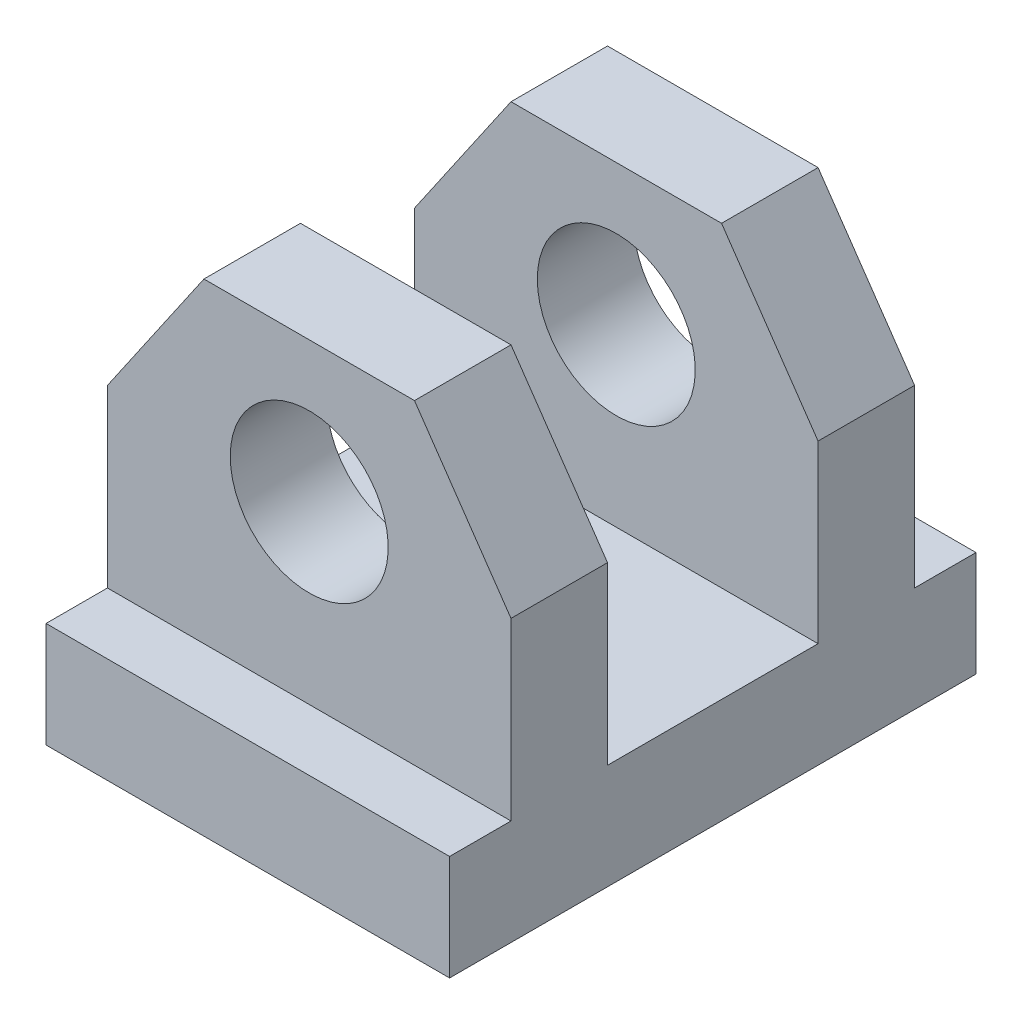
ISO-10303-21;
HEADER;
FILE_DESCRIPTION(('STEP AP214'),'2;1');
FILE_NAME('part.step','',(''),(''),'','','');
FILE_SCHEMA(('AUTOMOTIVE_DESIGN { 1 0 10303 214 1 1 1 1 }'));
ENDSEC;
DATA;
#1=APPLICATION_CONTEXT('core data for automotive mechanical design processes');
#2=APPLICATION_PROTOCOL_DEFINITION('international standard','automotive_design',2000,#1);
#3=PRODUCT_CONTEXT('',#1,'mechanical');
#4=PRODUCT('Part','Part','',(#3));
#5=PRODUCT_RELATED_PRODUCT_CATEGORY('part','',(#4));
#6=PRODUCT_DEFINITION_FORMATION('','',#4);
#7=PRODUCT_DEFINITION_CONTEXT('part definition',#1,'design');
#8=PRODUCT_DEFINITION('design','',#6,#7);
#9=PRODUCT_DEFINITION_SHAPE('','',#8);
#10=(LENGTH_UNIT() NAMED_UNIT(*) SI_UNIT(.MILLI.,.METRE.));
#11=(NAMED_UNIT(*) PLANE_ANGLE_UNIT() SI_UNIT($,.RADIAN.));
#12=(NAMED_UNIT(*) SI_UNIT($,.STERADIAN.) SOLID_ANGLE_UNIT());
#13=UNCERTAINTY_MEASURE_WITH_UNIT(LENGTH_MEASURE(1.E-05),#10,'distance_accuracy_value','');
#14=(GEOMETRIC_REPRESENTATION_CONTEXT(3) GLOBAL_UNCERTAINTY_ASSIGNED_CONTEXT((#13)) GLOBAL_UNIT_ASSIGNED_CONTEXT((#10,
#11,#12)) REPRESENTATION_CONTEXT('',''));
#15=CARTESIAN_POINT('',(0.,0.,0.));
#16=DIRECTION('',(0.,0.,1.));
#17=DIRECTION('',(1.,0.,0.));
#18=AXIS2_PLACEMENT_3D('',#15,#16,#17);
#19=CARTESIAN_POINT('',(23.,32.,60.));
#20=DIRECTION('',(-0.824041924199368,-0.566528822887065,0.));
#21=DIRECTION('',(0.566528822887065,-0.824041924199368,0.));
#22=AXIS2_PLACEMENT_3D('',#19,#20,#21);
#23=PLANE('',#22);
#24=DIRECTION('',(0.,0.,-1.));
#25=VECTOR('',#24,1.);
#26=CARTESIAN_POINT('',(12.,48.,60.));
#27=LINE('',#26,#25);
#28=CARTESIAN_POINT('',(12.,48.,18.));
#29=VERTEX_POINT('',#28);
#30=CARTESIAN_POINT('',(12.,48.,7.));
#31=VERTEX_POINT('',#30);
#32=EDGE_CURVE('E319',#29,#31,#27,.T.);
#33=ORIENTED_EDGE('',*,*,#32,.F.);
#34=DIRECTION('',(0.566528822887065,-0.824041924199368,0.));
#35=VECTOR('',#34,1.);
#36=CARTESIAN_POINT('',(23.,32.,18.));
#37=LINE('',#36,#35);
#38=CARTESIAN_POINT('',(23.,32.,18.));
#39=VERTEX_POINT('',#38);
#40=EDGE_CURVE('E208',#29,#39,#37,.T.);
#41=ORIENTED_EDGE('',*,*,#40,.T.);
#42=DIRECTION('',(0.,0.,-1.));
#43=VECTOR('',#42,1.);
#44=CARTESIAN_POINT('',(23.,32.,60.));
#45=LINE('',#44,#43);
#46=CARTESIAN_POINT('',(23.,32.,7.));
#47=VERTEX_POINT('',#46);
#48=EDGE_CURVE('E55',#39,#47,#45,.T.);
#49=ORIENTED_EDGE('',*,*,#48,.T.);
#50=DIRECTION('',(-0.566528822887065,0.824041924199368,0.));
#51=VECTOR('',#50,1.);
#52=CARTESIAN_POINT('',(23.,32.,7.));
#53=LINE('',#52,#51);
#54=EDGE_CURVE('E279',#47,#31,#53,.T.);
#55=ORIENTED_EDGE('',*,*,#54,.T.);
#56=EDGE_LOOP('',(#33,#41,#49,#55));
#57=FACE_BOUND('',#56,.T.);
#58=ADVANCED_FACE('F45',(#57),#23,.F.);
#59=CARTESIAN_POINT('',(12.,48.,60.));
#60=DIRECTION('',(0.,-1.,0.));
#61=DIRECTION('',(0.,0.,-1.));
#62=AXIS2_PLACEMENT_3D('',#59,#60,#61);
#63=PLANE('',#62);
#64=DIRECTION('',(0.,0.,-1.));
#65=VECTOR('',#64,1.);
#66=CARTESIAN_POINT('',(-12.,48.,60.));
#67=LINE('',#66,#65);
#68=CARTESIAN_POINT('',(-12.,48.,18.));
#69=VERTEX_POINT('',#68);
#70=CARTESIAN_POINT('',(-12.,48.,7.));
#71=VERTEX_POINT('',#70);
#72=EDGE_CURVE('E314',#69,#71,#67,.T.);
#73=ORIENTED_EDGE('',*,*,#72,.F.);
#74=DIRECTION('',(-1.,0.,0.));
#75=VECTOR('',#74,1.);
#76=CARTESIAN_POINT('',(-23.,48.,18.));
#77=LINE('',#76,#75);
#78=EDGE_CURVE('E179',#29,#69,#77,.T.);
#79=ORIENTED_EDGE('',*,*,#78,.F.);
#80=ORIENTED_EDGE('',*,*,#32,.T.);
#81=DIRECTION('',(1.,0.,0.));
#82=VECTOR('',#81,1.);
#83=CARTESIAN_POINT('',(-23.,48.,7.));
#84=LINE('',#83,#82);
#85=EDGE_CURVE('E225',#71,#31,#84,.T.);
#86=ORIENTED_EDGE('',*,*,#85,.F.);
#87=EDGE_LOOP('',(#73,#79,#80,#86));
#88=FACE_BOUND('',#87,.T.);
#89=ADVANCED_FACE('F370',(#88),#63,.F.);
#90=CARTESIAN_POINT('',(-12.,48.,60.));
#91=DIRECTION('',(0.824041924199368,-0.566528822887065,0.));
#92=DIRECTION('',(0.566528822887065,0.824041924199368,0.));
#93=AXIS2_PLACEMENT_3D('',#90,#91,#92);
#94=PLANE('',#93);
#95=DIRECTION('',(0.,0.,-1.));
#96=VECTOR('',#95,1.);
#97=CARTESIAN_POINT('',(-23.,32.,60.));
#98=LINE('',#97,#96);
#99=CARTESIAN_POINT('',(-23.,32.,18.));
#100=VERTEX_POINT('',#99);
#101=CARTESIAN_POINT('',(-23.,32.,7.));
#102=VERTEX_POINT('',#101);
#103=EDGE_CURVE('E311',#100,#102,#98,.T.);
#104=ORIENTED_EDGE('',*,*,#103,.F.);
#105=DIRECTION('',(0.566528822887065,0.824041924199368,0.));
#106=VECTOR('',#105,1.);
#107=CARTESIAN_POINT('',(-12.,48.,18.));
#108=LINE('',#107,#106);
#109=EDGE_CURVE('E204',#100,#69,#108,.T.);
#110=ORIENTED_EDGE('',*,*,#109,.T.);
#111=ORIENTED_EDGE('',*,*,#72,.T.);
#112=DIRECTION('',(-0.566528822887065,-0.824041924199368,0.));
#113=VECTOR('',#112,1.);
#114=CARTESIAN_POINT('',(-12.,48.,7.));
#115=LINE('',#114,#113);
#116=EDGE_CURVE('E275',#71,#102,#115,.T.);
#117=ORIENTED_EDGE('',*,*,#116,.T.);
#118=EDGE_LOOP('',(#104,#110,#111,#117));
#119=FACE_BOUND('',#118,.T.);
#120=ADVANCED_FACE('F367',(#119),#94,.F.);
#121=CARTESIAN_POINT('',(0.,32.,60.));
#122=DIRECTION('',(0.,0.,-1.));
#123=DIRECTION('',(-1.,0.,0.));
#124=AXIS2_PLACEMENT_3D('',#121,#122,#123);
#125=CYLINDRICAL_SURFACE('',#124,9.);
#126=CARTESIAN_POINT('',(0.,32.,18.));
#127=DIRECTION('',(0.,0.,-1.));
#128=DIRECTION('',(-1.,0.,0.));
#129=AXIS2_PLACEMENT_3D('',#126,#127,#128);
#130=CIRCLE('',#129,9.);
#131=CARTESIAN_POINT('',(-9.,32.,18.));
#132=VERTEX_POINT('',#131);
#133=EDGE_CURVE('E49',#132,#132,#130,.T.);
#134=ORIENTED_EDGE('',*,*,#133,.F.);
#135=EDGE_LOOP('',(#134));
#136=FACE_BOUND('',#135,.T.);
#137=CARTESIAN_POINT('',(0.,32.,7.));
#138=DIRECTION('',(0.,0.,1.));
#139=DIRECTION('',(1.,0.,0.));
#140=AXIS2_PLACEMENT_3D('',#137,#138,#139);
#141=CIRCLE('',#140,9.);
#142=CARTESIAN_POINT('',(9.,32.,7.));
#143=VERTEX_POINT('',#142);
#144=EDGE_CURVE('E274',#143,#143,#141,.T.);
#145=ORIENTED_EDGE('',*,*,#144,.F.);
#146=EDGE_LOOP('',(#145));
#147=FACE_BOUND('',#146,.T.);
#148=ADVANCED_FACE('F339',(#136,#147),#125,.F.);
#149=CARTESIAN_POINT('',(0.,0.,0.));
#150=DIRECTION('',(0.,0.,1.));
#151=DIRECTION('',(1.,0.,0.));
#152=AXIS2_PLACEMENT_3D('',#149,#150,#151);
#153=PLANE('',#152);
#154=DIRECTION('',(-1.,0.,0.));
#155=VECTOR('',#154,1.);
#156=CARTESIAN_POINT('',(-23.,12.,0.));
#157=LINE('',#156,#155);
#158=CARTESIAN_POINT('',(23.,12.,0.));
#159=VERTEX_POINT('',#158);
#160=CARTESIAN_POINT('',(-23.,12.,0.));
#161=VERTEX_POINT('',#160);
#162=EDGE_CURVE('E232',#159,#161,#157,.T.);
#163=ORIENTED_EDGE('',*,*,#162,.F.);
#164=DIRECTION('',(0.,1.,0.));
#165=VECTOR('',#164,1.);
#166=CARTESIAN_POINT('',(23.,0.,0.));
#167=LINE('',#166,#165);
#168=CARTESIAN_POINT('',(23.,0.,0.));
#169=VERTEX_POINT('',#168);
#170=EDGE_CURVE('E283',#169,#159,#167,.T.);
#171=ORIENTED_EDGE('',*,*,#170,.F.);
#172=DIRECTION('',(1.,0.,0.));
#173=VECTOR('',#172,1.);
#174=CARTESIAN_POINT('',(-23.,0.,0.));
#175=LINE('',#174,#173);
#176=CARTESIAN_POINT('',(-23.,0.,0.));
#177=VERTEX_POINT('',#176);
#178=EDGE_CURVE('E289',#177,#169,#175,.T.);
#179=ORIENTED_EDGE('',*,*,#178,.F.);
#180=DIRECTION('',(0.,-1.,0.));
#181=VECTOR('',#180,1.);
#182=CARTESIAN_POINT('',(-23.,32.,0.));
#183=LINE('',#182,#181);
#184=EDGE_CURVE('E299',#161,#177,#183,.T.);
#185=ORIENTED_EDGE('',*,*,#184,.F.);
#186=EDGE_LOOP('',(#163,#171,#179,#185));
#187=FACE_BOUND('',#186,.T.);
#188=ADVANCED_FACE('F381',(#187),#153,.F.);
#189=CARTESIAN_POINT('',(0.,0.,60.));
#190=DIRECTION('',(0.,0.,1.));
#191=DIRECTION('',(1.,0.,0.));
#192=AXIS2_PLACEMENT_3D('',#189,#190,#191);
#193=PLANE('',#192);
#194=DIRECTION('',(1.,0.,0.));
#195=VECTOR('',#194,1.);
#196=CARTESIAN_POINT('',(-23.,12.,60.));
#197=LINE('',#196,#195);
#198=CARTESIAN_POINT('',(-23.,12.,60.));
#199=VERTEX_POINT('',#198);
#200=CARTESIAN_POINT('',(23.,12.,60.));
#201=VERTEX_POINT('',#200);
#202=EDGE_CURVE('E261',#199,#201,#197,.T.);
#203=ORIENTED_EDGE('',*,*,#202,.F.);
#204=DIRECTION('',(0.,-1.,0.));
#205=VECTOR('',#204,1.);
#206=CARTESIAN_POINT('',(-23.,32.,60.));
#207=LINE('',#206,#205);
#208=CARTESIAN_POINT('',(-23.,0.,60.));
#209=VERTEX_POINT('',#208);
#210=EDGE_CURVE('E288',#199,#209,#207,.T.);
#211=ORIENTED_EDGE('',*,*,#210,.T.);
#212=DIRECTION('',(1.,0.,0.));
#213=VECTOR('',#212,1.);
#214=CARTESIAN_POINT('',(-23.,0.,60.));
#215=LINE('',#214,#213);
#216=CARTESIAN_POINT('',(23.,0.,60.));
#217=VERTEX_POINT('',#216);
#218=EDGE_CURVE('E292',#209,#217,#215,.T.);
#219=ORIENTED_EDGE('',*,*,#218,.T.);
#220=DIRECTION('',(0.,1.,0.));
#221=VECTOR('',#220,1.);
#222=CARTESIAN_POINT('',(23.,0.,60.));
#223=LINE('',#222,#221);
#224=EDGE_CURVE('E284',#217,#201,#223,.T.);
#225=ORIENTED_EDGE('',*,*,#224,.T.);
#226=EDGE_LOOP('',(#203,#211,#219,#225));
#227=FACE_BOUND('',#226,.T.);
#228=ADVANCED_FACE('F415',(#227),#193,.T.);
#229=CARTESIAN_POINT('',(23.,0.,60.));
#230=DIRECTION('',(-1.,0.,0.));
#231=DIRECTION('',(0.,-1.,0.));
#232=AXIS2_PLACEMENT_3D('',#229,#230,#231);
#233=PLANE('',#232);
#234=ORIENTED_EDGE('',*,*,#48,.F.);
#235=DIRECTION('',(0.,-1.,0.));
#236=VECTOR('',#235,1.);
#237=CARTESIAN_POINT('',(23.,0.,18.));
#238=LINE('',#237,#236);
#239=CARTESIAN_POINT('',(23.,12.,18.));
#240=VERTEX_POINT('',#239);
#241=EDGE_CURVE('E212',#39,#240,#238,.T.);
#242=ORIENTED_EDGE('',*,*,#241,.T.);
#243=DIRECTION('',(0.,0.,-1.));
#244=VECTOR('',#243,1.);
#245=CARTESIAN_POINT('',(23.,12.,60.));
#246=LINE('',#245,#244);
#247=CARTESIAN_POINT('',(23.,12.,42.));
#248=VERTEX_POINT('',#247);
#249=EDGE_CURVE('E216',#248,#240,#246,.T.);
#250=ORIENTED_EDGE('',*,*,#249,.F.);
#251=DIRECTION('',(0.,1.,0.));
#252=VECTOR('',#251,1.);
#253=CARTESIAN_POINT('',(23.,0.,42.));
#254=LINE('',#253,#252);
#255=CARTESIAN_POINT('',(23.,32.,42.));
#256=VERTEX_POINT('',#255);
#257=EDGE_CURVE('E168',#248,#256,#254,.T.);
#258=ORIENTED_EDGE('',*,*,#257,.T.);
#259=CARTESIAN_POINT('',(23.,32.,53.));
#260=VERTEX_POINT('',#259);
#261=EDGE_CURVE('E11',#260,#256,#45,.T.);
#262=ORIENTED_EDGE('',*,*,#261,.F.);
#263=DIRECTION('',(0.,1.,0.));
#264=VECTOR('',#263,1.);
#265=CARTESIAN_POINT('',(23.,12.,53.));
#266=LINE('',#265,#264);
#267=CARTESIAN_POINT('',(23.,12.,53.));
#268=VERTEX_POINT('',#267);
#269=EDGE_CURVE('E248',#268,#260,#266,.T.);
#270=ORIENTED_EDGE('',*,*,#269,.F.);
#271=DIRECTION('',(0.,0.,-1.));
#272=VECTOR('',#271,1.);
#273=CARTESIAN_POINT('',(23.,12.,60.));
#274=LINE('',#273,#272);
#275=EDGE_CURVE('E258',#201,#268,#274,.T.);
#276=ORIENTED_EDGE('',*,*,#275,.F.);
#277=ORIENTED_EDGE('',*,*,#224,.F.);
#278=DIRECTION('',(0.,0.,-1.));
#279=VECTOR('',#278,1.);
#280=CARTESIAN_POINT('',(23.,0.,60.));
#281=LINE('',#280,#279);
#282=EDGE_CURVE('E295',#217,#169,#281,.T.);
#283=ORIENTED_EDGE('',*,*,#282,.T.);
#284=ORIENTED_EDGE('',*,*,#170,.T.);
#285=DIRECTION('',(0.,0.,-1.));
#286=VECTOR('',#285,1.);
#287=CARTESIAN_POINT('',(23.,12.,0.));
#288=LINE('',#287,#286);
#289=CARTESIAN_POINT('',(23.,12.,7.));
#290=VERTEX_POINT('',#289);
#291=EDGE_CURVE('E229',#290,#159,#288,.T.);
#292=ORIENTED_EDGE('',*,*,#291,.F.);
#293=DIRECTION('',(0.,1.,0.));
#294=VECTOR('',#293,1.);
#295=CARTESIAN_POINT('',(23.,12.,7.));
#296=LINE('',#295,#294);
#297=EDGE_CURVE('E240',#290,#47,#296,.T.);
#298=ORIENTED_EDGE('',*,*,#297,.T.);
#299=EDGE_LOOP('',(#234,#242,#250,#258,#262,#270,#276,#277,#283,#284,#292,#298));
#300=FACE_BOUND('',#299,.T.);
#301=ADVANCED_FACE('F47',(#300),#233,.F.);
#302=ORIENTED_EDGE('',*,*,#261,.T.);
#303=DIRECTION('',(-0.566528822887065,0.824041924199368,0.));
#304=VECTOR('',#303,1.);
#305=CARTESIAN_POINT('',(23.,32.,42.));
#306=LINE('',#305,#304);
#307=CARTESIAN_POINT('',(12.,48.,42.));
#308=VERTEX_POINT('',#307);
#309=EDGE_CURVE('E198',#256,#308,#306,.T.);
#310=ORIENTED_EDGE('',*,*,#309,.T.);
#311=CARTESIAN_POINT('',(12.,48.,53.));
#312=VERTEX_POINT('',#311);
#313=EDGE_CURVE('E320',#312,#308,#27,.T.);
#314=ORIENTED_EDGE('',*,*,#313,.F.);
#315=DIRECTION('',(0.566528822887065,-0.824041924199368,0.));
#316=VECTOR('',#315,1.);
#317=CARTESIAN_POINT('',(23.,32.,53.));
#318=LINE('',#317,#316);
#319=EDGE_CURVE('E270',#312,#260,#318,.T.);
#320=ORIENTED_EDGE('',*,*,#319,.T.);
#321=EDGE_LOOP('',(#302,#310,#314,#320));
#322=FACE_BOUND('',#321,.T.);
#323=ADVANCED_FACE('F408',(#322),#23,.F.);
#324=ORIENTED_EDGE('',*,*,#313,.T.);
#325=DIRECTION('',(1.,0.,0.));
#326=VECTOR('',#325,1.);
#327=CARTESIAN_POINT('',(-23.,48.,42.));
#328=LINE('',#327,#326);
#329=CARTESIAN_POINT('',(-12.,48.,42.));
#330=VERTEX_POINT('',#329);
#331=EDGE_CURVE('E356',#330,#308,#328,.T.);
#332=ORIENTED_EDGE('',*,*,#331,.F.);
#333=CARTESIAN_POINT('',(-12.,48.,53.));
#334=VERTEX_POINT('',#333);
#335=EDGE_CURVE('E315',#334,#330,#67,.T.);
#336=ORIENTED_EDGE('',*,*,#335,.F.);
#337=DIRECTION('',(-1.,0.,0.));
#338=VECTOR('',#337,1.);
#339=CARTESIAN_POINT('',(-23.,48.,53.));
#340=LINE('',#339,#338);
#341=EDGE_CURVE('E239',#312,#334,#340,.T.);
#342=ORIENTED_EDGE('',*,*,#341,.F.);
#343=EDGE_LOOP('',(#324,#332,#336,#342));
#344=FACE_BOUND('',#343,.T.);
#345=ADVANCED_FACE('F355',(#344),#63,.F.);
#346=ORIENTED_EDGE('',*,*,#335,.T.);
#347=DIRECTION('',(-0.566528822887065,-0.824041924199368,0.));
#348=VECTOR('',#347,1.);
#349=CARTESIAN_POINT('',(-12.,48.,42.));
#350=LINE('',#349,#348);
#351=CARTESIAN_POINT('',(-23.,32.,42.));
#352=VERTEX_POINT('',#351);
#353=EDGE_CURVE('E195',#330,#352,#350,.T.);
#354=ORIENTED_EDGE('',*,*,#353,.T.);
#355=CARTESIAN_POINT('',(-23.,32.,53.));
#356=VERTEX_POINT('',#355);
#357=EDGE_CURVE('E185',#356,#352,#98,.T.);
#358=ORIENTED_EDGE('',*,*,#357,.F.);
#359=DIRECTION('',(0.566528822887065,0.824041924199368,0.));
#360=VECTOR('',#359,1.);
#361=CARTESIAN_POINT('',(-12.,48.,53.));
#362=LINE('',#361,#360);
#363=EDGE_CURVE('E266',#356,#334,#362,.T.);
#364=ORIENTED_EDGE('',*,*,#363,.T.);
#365=EDGE_LOOP('',(#346,#354,#358,#364));
#366=FACE_BOUND('',#365,.T.);
#367=ADVANCED_FACE('F353',(#366),#94,.F.);
#368=CARTESIAN_POINT('',(-23.,32.,60.));
#369=DIRECTION('',(1.,0.,0.));
#370=DIRECTION('',(0.,1.,0.));
#371=AXIS2_PLACEMENT_3D('',#368,#369,#370);
#372=PLANE('',#371);
#373=DIRECTION('',(0.,0.,1.));
#374=VECTOR('',#373,1.);
#375=CARTESIAN_POINT('',(-23.,12.,18.));
#376=LINE('',#375,#374);
#377=CARTESIAN_POINT('',(-23.,12.,18.));
#378=VERTEX_POINT('',#377);
#379=CARTESIAN_POINT('',(-23.,12.,42.));
#380=VERTEX_POINT('',#379);
#381=EDGE_CURVE('E173',#378,#380,#376,.T.);
#382=ORIENTED_EDGE('',*,*,#381,.F.);
#383=DIRECTION('',(0.,1.,0.));
#384=VECTOR('',#383,1.);
#385=CARTESIAN_POINT('',(-23.,12.,18.));
#386=LINE('',#385,#384);
#387=EDGE_CURVE('E63',#378,#100,#386,.T.);
#388=ORIENTED_EDGE('',*,*,#387,.T.);
#389=ORIENTED_EDGE('',*,*,#103,.T.);
#390=DIRECTION('',(0.,1.,0.));
#391=VECTOR('',#390,1.);
#392=CARTESIAN_POINT('',(-23.,12.,7.));
#393=LINE('',#392,#391);
#394=CARTESIAN_POINT('',(-23.,12.,7.));
#395=VERTEX_POINT('',#394);
#396=EDGE_CURVE('E235',#395,#102,#393,.T.);
#397=ORIENTED_EDGE('',*,*,#396,.F.);
#398=DIRECTION('',(0.,0.,1.));
#399=VECTOR('',#398,1.);
#400=CARTESIAN_POINT('',(-23.,12.,0.));
#401=LINE('',#400,#399);
#402=EDGE_CURVE('E220',#161,#395,#401,.T.);
#403=ORIENTED_EDGE('',*,*,#402,.F.);
#404=ORIENTED_EDGE('',*,*,#184,.T.);
#405=DIRECTION('',(0.,0.,-1.));
#406=VECTOR('',#405,1.);
#407=CARTESIAN_POINT('',(-23.,0.,60.));
#408=LINE('',#407,#406);
#409=EDGE_CURVE('E307',#209,#177,#408,.T.);
#410=ORIENTED_EDGE('',*,*,#409,.F.);
#411=ORIENTED_EDGE('',*,*,#210,.F.);
#412=DIRECTION('',(0.,0.,1.));
#413=VECTOR('',#412,1.);
#414=CARTESIAN_POINT('',(-23.,12.,60.));
#415=LINE('',#414,#413);
#416=CARTESIAN_POINT('',(-23.,12.,53.));
#417=VERTEX_POINT('',#416);
#418=EDGE_CURVE('E255',#417,#199,#415,.T.);
#419=ORIENTED_EDGE('',*,*,#418,.F.);
#420=DIRECTION('',(0.,1.,0.));
#421=VECTOR('',#420,1.);
#422=CARTESIAN_POINT('',(-23.,12.,53.));
#423=LINE('',#422,#421);
#424=EDGE_CURVE('E219',#417,#356,#423,.T.);
#425=ORIENTED_EDGE('',*,*,#424,.T.);
#426=ORIENTED_EDGE('',*,*,#357,.T.);
#427=DIRECTION('',(0.,1.,0.));
#428=VECTOR('',#427,1.);
#429=CARTESIAN_POINT('',(-23.,12.,42.));
#430=LINE('',#429,#428);
#431=EDGE_CURVE('E165',#380,#352,#430,.T.);
#432=ORIENTED_EDGE('',*,*,#431,.F.);
#433=EDGE_LOOP('',(#382,#388,#389,#397,#403,#404,#410,#411,#419,#425,#426,#432));
#434=FACE_BOUND('',#433,.T.);
#435=ADVANCED_FACE('F182',(#434),#372,.F.);
#436=CARTESIAN_POINT('',(-23.,0.,60.));
#437=DIRECTION('',(0.,1.,0.));
#438=DIRECTION('',(-1.,0.,0.));
#439=AXIS2_PLACEMENT_3D('',#436,#437,#438);
#440=PLANE('',#439);
#441=ORIENTED_EDGE('',*,*,#178,.T.);
#442=ORIENTED_EDGE('',*,*,#282,.F.);
#443=ORIENTED_EDGE('',*,*,#218,.F.);
#444=ORIENTED_EDGE('',*,*,#409,.T.);
#445=EDGE_LOOP('',(#441,#442,#443,#444));
#446=FACE_BOUND('',#445,.T.);
#447=ADVANCED_FACE('F346',(#446),#440,.F.);
#448=CARTESIAN_POINT('',(-23.,12.,53.));
#449=DIRECTION('',(0.,0.,-1.));
#450=DIRECTION('',(-1.,0.,0.));
#451=AXIS2_PLACEMENT_3D('',#448,#449,#450);
#452=PLANE('',#451);
#453=CARTESIAN_POINT('',(0.,32.,53.));
#454=DIRECTION('',(0.,0.,-1.));
#455=DIRECTION('',(-1.,0.,0.));
#456=AXIS2_PLACEMENT_3D('',#453,#454,#455);
#457=CIRCLE('',#456,9.);
#458=CARTESIAN_POINT('',(-9.,32.,53.));
#459=VERTEX_POINT('',#458);
#460=EDGE_CURVE('E244',#459,#459,#457,.T.);
#461=ORIENTED_EDGE('',*,*,#460,.T.);
#462=EDGE_LOOP('',(#461));
#463=FACE_BOUND('',#462,.T.);
#464=ORIENTED_EDGE('',*,*,#341,.T.);
#465=ORIENTED_EDGE('',*,*,#363,.F.);
#466=ORIENTED_EDGE('',*,*,#424,.F.);
#467=DIRECTION('',(-1.,0.,0.));
#468=VECTOR('',#467,1.);
#469=CARTESIAN_POINT('',(-23.,12.,53.));
#470=LINE('',#469,#468);
#471=EDGE_CURVE('E71',#268,#417,#470,.T.);
#472=ORIENTED_EDGE('',*,*,#471,.F.);
#473=ORIENTED_EDGE('',*,*,#269,.T.);
#474=ORIENTED_EDGE('',*,*,#319,.F.);
#475=EDGE_LOOP('',(#464,#465,#466,#472,#473,#474));
#476=FACE_BOUND('',#475,.T.);
#477=ADVANCED_FACE('F342',(#463,#476),#452,.F.);
#478=CARTESIAN_POINT('',(0.,12.,0.));
#479=DIRECTION('',(0.,-1.,0.));
#480=DIRECTION('',(0.,0.,-1.));
#481=AXIS2_PLACEMENT_3D('',#478,#479,#480);
#482=PLANE('',#481);
#483=ORIENTED_EDGE('',*,*,#418,.T.);
#484=ORIENTED_EDGE('',*,*,#202,.T.);
#485=ORIENTED_EDGE('',*,*,#275,.T.);
#486=ORIENTED_EDGE('',*,*,#471,.T.);
#487=EDGE_LOOP('',(#483,#484,#485,#486));
#488=FACE_BOUND('',#487,.T.);
#489=ADVANCED_FACE('F345',(#488),#482,.F.);
#490=CARTESIAN_POINT('',(-23.,12.,7.));
#491=DIRECTION('',(0.,0.,1.));
#492=DIRECTION('',(1.,0.,0.));
#493=AXIS2_PLACEMENT_3D('',#490,#491,#492);
#494=PLANE('',#493);
#495=ORIENTED_EDGE('',*,*,#144,.T.);
#496=EDGE_LOOP('',(#495));
#497=FACE_BOUND('',#496,.T.);
#498=ORIENTED_EDGE('',*,*,#297,.F.);
#499=DIRECTION('',(1.,0.,0.));
#500=VECTOR('',#499,1.);
#501=CARTESIAN_POINT('',(-23.,12.,7.));
#502=LINE('',#501,#500);
#503=EDGE_CURVE('E224',#395,#290,#502,.T.);
#504=ORIENTED_EDGE('',*,*,#503,.F.);
#505=ORIENTED_EDGE('',*,*,#396,.T.);
#506=ORIENTED_EDGE('',*,*,#116,.F.);
#507=ORIENTED_EDGE('',*,*,#85,.T.);
#508=ORIENTED_EDGE('',*,*,#54,.F.);
#509=EDGE_LOOP('',(#498,#504,#505,#506,#507,#508));
#510=FACE_BOUND('',#509,.T.);
#511=ADVANCED_FACE('F384',(#497,#510),#494,.F.);
#512=CARTESIAN_POINT('',(0.,12.,0.));
#513=DIRECTION('',(0.,1.,0.));
#514=DIRECTION('',(0.,0.,1.));
#515=AXIS2_PLACEMENT_3D('',#512,#513,#514);
#516=PLANE('',#515);
#517=ORIENTED_EDGE('',*,*,#402,.T.);
#518=ORIENTED_EDGE('',*,*,#503,.T.);
#519=ORIENTED_EDGE('',*,*,#291,.T.);
#520=ORIENTED_EDGE('',*,*,#162,.T.);
#521=EDGE_LOOP('',(#517,#518,#519,#520));
#522=FACE_BOUND('',#521,.T.);
#523=ADVANCED_FACE('F337',(#522),#516,.T.);
#524=CARTESIAN_POINT('',(0.,32.,42.));
#525=DIRECTION('',(0.,0.,1.));
#526=DIRECTION('',(1.,0.,0.));
#527=AXIS2_PLACEMENT_3D('',#524,#525,#526);
#528=CIRCLE('',#527,9.);
#529=CARTESIAN_POINT('',(9.,32.,42.));
#530=VERTEX_POINT('',#529);
#531=EDGE_CURVE('E190',#530,#530,#528,.T.);
#532=ORIENTED_EDGE('',*,*,#531,.F.);
#533=EDGE_LOOP('',(#532));
#534=FACE_BOUND('',#533,.T.);
#535=ORIENTED_EDGE('',*,*,#460,.F.);
#536=EDGE_LOOP('',(#535));
#537=FACE_BOUND('',#536,.T.);
#538=ADVANCED_FACE('F334',(#534,#537),#125,.F.);
#539=CARTESIAN_POINT('',(0.,12.,0.));
#540=DIRECTION('',(0.,1.,0.));
#541=DIRECTION('',(0.,0.,1.));
#542=AXIS2_PLACEMENT_3D('',#539,#540,#541);
#543=PLANE('',#542);
#544=ORIENTED_EDGE('',*,*,#249,.T.);
#545=DIRECTION('',(-1.,0.,0.));
#546=VECTOR('',#545,1.);
#547=CARTESIAN_POINT('',(-23.,12.,18.));
#548=LINE('',#547,#546);
#549=EDGE_CURVE('E172',#240,#378,#548,.T.);
#550=ORIENTED_EDGE('',*,*,#549,.T.);
#551=ORIENTED_EDGE('',*,*,#381,.T.);
#552=DIRECTION('',(1.,0.,0.));
#553=VECTOR('',#552,1.);
#554=CARTESIAN_POINT('',(-23.,12.,42.));
#555=LINE('',#554,#553);
#556=EDGE_CURVE('E161',#380,#248,#555,.T.);
#557=ORIENTED_EDGE('',*,*,#556,.T.);
#558=EDGE_LOOP('',(#544,#550,#551,#557));
#559=FACE_BOUND('',#558,.T.);
#560=ADVANCED_FACE('F176',(#559),#543,.T.);
#561=CARTESIAN_POINT('',(-23.,12.,18.));
#562=DIRECTION('',(0.,0.,-1.));
#563=DIRECTION('',(-1.,0.,0.));
#564=AXIS2_PLACEMENT_3D('',#561,#562,#563);
#565=PLANE('',#564);
#566=ORIENTED_EDGE('',*,*,#133,.T.);
#567=EDGE_LOOP('',(#566));
#568=FACE_BOUND('',#567,.T.);
#569=ORIENTED_EDGE('',*,*,#40,.F.);
#570=ORIENTED_EDGE('',*,*,#78,.T.);
#571=ORIENTED_EDGE('',*,*,#109,.F.);
#572=ORIENTED_EDGE('',*,*,#387,.F.);
#573=ORIENTED_EDGE('',*,*,#549,.F.);
#574=ORIENTED_EDGE('',*,*,#241,.F.);
#575=EDGE_LOOP('',(#569,#570,#571,#572,#573,#574));
#576=FACE_BOUND('',#575,.T.);
#577=ADVANCED_FACE('F361',(#568,#576),#565,.F.);
#578=CARTESIAN_POINT('',(-23.,12.,42.));
#579=DIRECTION('',(0.,0.,1.));
#580=DIRECTION('',(1.,0.,0.));
#581=AXIS2_PLACEMENT_3D('',#578,#579,#580);
#582=PLANE('',#581);
#583=ORIENTED_EDGE('',*,*,#531,.T.);
#584=EDGE_LOOP('',(#583));
#585=FACE_BOUND('',#584,.T.);
#586=ORIENTED_EDGE('',*,*,#556,.F.);
#587=ORIENTED_EDGE('',*,*,#431,.T.);
#588=ORIENTED_EDGE('',*,*,#353,.F.);
#589=ORIENTED_EDGE('',*,*,#331,.T.);
#590=ORIENTED_EDGE('',*,*,#309,.F.);
#591=ORIENTED_EDGE('',*,*,#257,.F.);
#592=EDGE_LOOP('',(#586,#587,#588,#589,#590,#591));
#593=FACE_BOUND('',#592,.T.);
#594=ADVANCED_FACE('F163',(#585,#593),#582,.F.);
#595=CLOSED_SHELL('',(#58,#89,#120,#148,#188,#228,#301,#323,#345,#367,#435,#447,#477,#489,#511,
#523,#538,#560,#577,#594));
#596=MANIFOLD_SOLID_BREP('B2',#595);
#597=ADVANCED_BREP_SHAPE_REPRESENTATION('',(#18,#596),#14);
#598=SHAPE_DEFINITION_REPRESENTATION(#9,#597);
ENDSEC;
END-ISO-10303-21;
